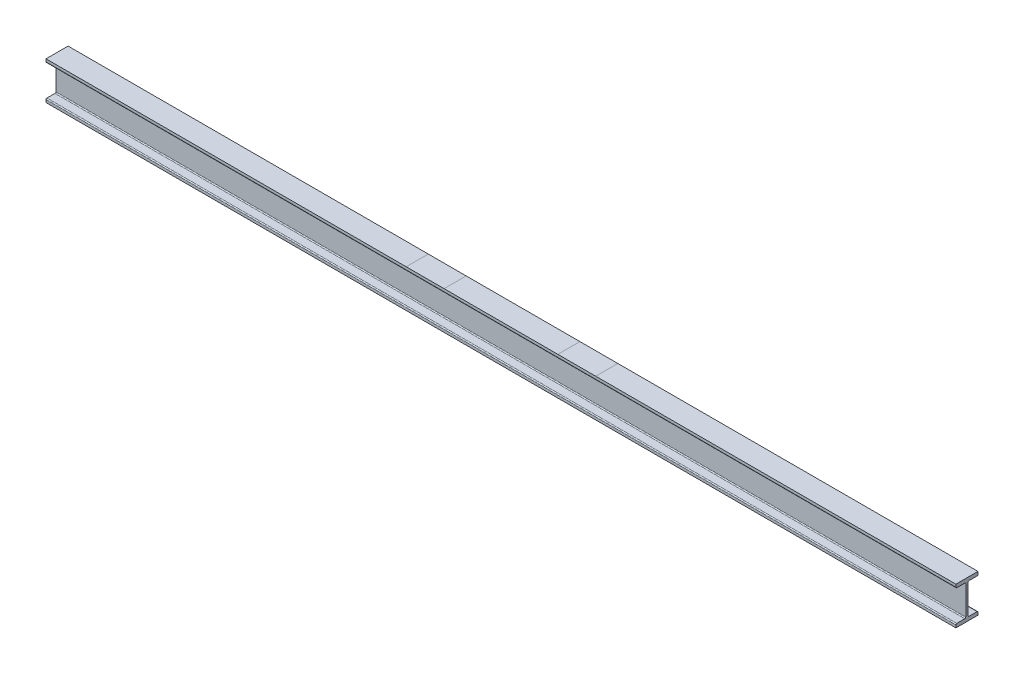
ISO-10303-21;
HEADER;
FILE_DESCRIPTION(('STEP AP214'),'2;1');
FILE_NAME('part.step','',(''),(''),'','','');
FILE_SCHEMA(('AUTOMOTIVE_DESIGN { 1 0 10303 214 1 1 1 1 }'));
ENDSEC;
DATA;
#1=APPLICATION_CONTEXT('core data for automotive mechanical design processes');
#2=APPLICATION_PROTOCOL_DEFINITION('international standard','automotive_design',2000,#1);
#3=PRODUCT_CONTEXT('',#1,'mechanical');
#4=PRODUCT('Part','Part','',(#3));
#5=PRODUCT_RELATED_PRODUCT_CATEGORY('part','',(#4));
#6=PRODUCT_DEFINITION_FORMATION('','',#4);
#7=PRODUCT_DEFINITION_CONTEXT('part definition',#1,'design');
#8=PRODUCT_DEFINITION('design','',#6,#7);
#9=PRODUCT_DEFINITION_SHAPE('','',#8);
#10=(LENGTH_UNIT() NAMED_UNIT(*) SI_UNIT(.MILLI.,.METRE.));
#11=(NAMED_UNIT(*) PLANE_ANGLE_UNIT() SI_UNIT($,.RADIAN.));
#12=(NAMED_UNIT(*) SI_UNIT($,.STERADIAN.) SOLID_ANGLE_UNIT());
#13=UNCERTAINTY_MEASURE_WITH_UNIT(LENGTH_MEASURE(1.E-05),#10,'distance_accuracy_value','');
#14=(GEOMETRIC_REPRESENTATION_CONTEXT(3) GLOBAL_UNCERTAINTY_ASSIGNED_CONTEXT((#13)) GLOBAL_UNIT_ASSIGNED_CONTEXT((#10,
#11,#12)) REPRESENTATION_CONTEXT('',''));
#15=CARTESIAN_POINT('',(0.,0.,0.));
#16=DIRECTION('',(0.,0.,1.));
#17=DIRECTION('',(1.,0.,0.));
#18=AXIS2_PLACEMENT_3D('',#15,#16,#17);
#19=CARTESIAN_POINT('',(2365.56791139241,50.8,29.591));
#20=DIRECTION('',(0.,-1.,0.));
#21=DIRECTION('',(0.,0.,-1.));
#22=AXIS2_PLACEMENT_3D('',#19,#20,#21);
#23=PLANE('',#22);
#24=DIRECTION('',(0.,0.,1.));
#25=VECTOR('',#24,1.);
#26=CARTESIAN_POINT('',(1400.36791139241,50.8,29.591));
#27=LINE('',#26,#25);
#28=CARTESIAN_POINT('',(1400.36791139241,50.8,-29.591));
#29=VERTEX_POINT('',#28);
#30=CARTESIAN_POINT('',(1400.36791139241,50.8,29.591));
#31=VERTEX_POINT('',#30);
#32=EDGE_CURVE('E11',#29,#31,#27,.T.);
#33=ORIENTED_EDGE('',*,*,#32,.F.);
#34=DIRECTION('',(-1.,0.,0.));
#35=VECTOR('',#34,1.);
#36=CARTESIAN_POINT('',(2365.56791139241,50.8,-29.591));
#37=LINE('',#36,#35);
#38=CARTESIAN_POINT('',(1298.76791139241,50.8,-29.591));
#39=VERTEX_POINT('',#38);
#40=EDGE_CURVE('E246',#29,#39,#37,.T.);
#41=ORIENTED_EDGE('',*,*,#40,.T.);
#42=DIRECTION('',(0.,0.,1.));
#43=VECTOR('',#42,1.);
#44=CARTESIAN_POINT('',(1298.76791139241,50.8,29.591));
#45=LINE('',#44,#43);
#46=CARTESIAN_POINT('',(1298.76791139241,50.8,29.591));
#47=VERTEX_POINT('',#46);
#48=EDGE_CURVE('E52',#39,#47,#45,.T.);
#49=ORIENTED_EDGE('',*,*,#48,.T.);
#50=DIRECTION('',(-1.,0.,0.));
#51=VECTOR('',#50,1.);
#52=CARTESIAN_POINT('',(2365.56791139241,50.8,29.591));
#53=LINE('',#52,#51);
#54=EDGE_CURVE('E244',#31,#47,#53,.T.);
#55=ORIENTED_EDGE('',*,*,#54,.F.);
#56=EDGE_LOOP('',(#33,#41,#49,#55));
#57=FACE_BOUND('',#56,.T.);
#58=ADVANCED_FACE('F43',(#57),#23,.F.);
#59=ORIENTED_EDGE('',*,*,#48,.F.);
#60=CARTESIAN_POINT('',(993.967911392406,50.8,-29.591));
#61=VERTEX_POINT('',#60);
#62=EDGE_CURVE('E423',#39,#61,#37,.T.);
#63=ORIENTED_EDGE('',*,*,#62,.T.);
#64=DIRECTION('',(0.,0.,1.));
#65=VECTOR('',#64,1.);
#66=CARTESIAN_POINT('',(993.967911392406,50.8,29.5910000000001));
#67=LINE('',#66,#65);
#68=CARTESIAN_POINT('',(993.967911392406,50.8,29.591));
#69=VERTEX_POINT('',#68);
#70=EDGE_CURVE('E230',#61,#69,#67,.T.);
#71=ORIENTED_EDGE('',*,*,#70,.T.);
#72=EDGE_CURVE('E249',#47,#69,#53,.T.);
#73=ORIENTED_EDGE('',*,*,#72,.F.);
#74=EDGE_LOOP('',(#59,#63,#71,#73));
#75=FACE_BOUND('',#74,.T.);
#76=ADVANCED_FACE('F250',(#75),#23,.F.);
#77=ORIENTED_EDGE('',*,*,#70,.F.);
#78=CARTESIAN_POINT('',(892.367911392405,50.8,-29.591));
#79=VERTEX_POINT('',#78);
#80=EDGE_CURVE('E424',#61,#79,#37,.T.);
#81=ORIENTED_EDGE('',*,*,#80,.T.);
#82=DIRECTION('',(0.,0.,1.));
#83=VECTOR('',#82,1.);
#84=CARTESIAN_POINT('',(892.367911392405,50.8,29.591));
#85=LINE('',#84,#83);
#86=CARTESIAN_POINT('',(892.367911392405,50.8,29.591));
#87=VERTEX_POINT('',#86);
#88=EDGE_CURVE('E226',#79,#87,#85,.T.);
#89=ORIENTED_EDGE('',*,*,#88,.T.);
#90=EDGE_CURVE('E254',#69,#87,#53,.T.);
#91=ORIENTED_EDGE('',*,*,#90,.F.);
#92=EDGE_LOOP('',(#77,#81,#89,#91));
#93=FACE_BOUND('',#92,.T.);
#94=ADVANCED_FACE('F426',(#93),#23,.F.);
#95=ORIENTED_EDGE('',*,*,#88,.F.);
#96=CARTESIAN_POINT('',(-72.832088607595,50.8,-29.591));
#97=VERTEX_POINT('',#96);
#98=EDGE_CURVE('E260',#79,#97,#37,.T.);
#99=ORIENTED_EDGE('',*,*,#98,.T.);
#100=DIRECTION('',(0.,0.,1.));
#101=VECTOR('',#100,1.);
#102=CARTESIAN_POINT('',(-72.832088607595,50.8,29.591));
#103=LINE('',#102,#101);
#104=CARTESIAN_POINT('',(-72.832088607595,50.8,29.591));
#105=VERTEX_POINT('',#104);
#106=EDGE_CURVE('E316',#97,#105,#103,.T.);
#107=ORIENTED_EDGE('',*,*,#106,.T.);
#108=EDGE_CURVE('E257',#87,#105,#53,.T.);
#109=ORIENTED_EDGE('',*,*,#108,.F.);
#110=EDGE_LOOP('',(#95,#99,#107,#109));
#111=FACE_BOUND('',#110,.T.);
#112=ADVANCED_FACE('F372',(#111),#23,.F.);
#113=CARTESIAN_POINT('',(2365.56791139241,-50.8,-29.591));
#114=DIRECTION('',(0.,1.,0.));
#115=DIRECTION('',(0.,0.,1.));
#116=AXIS2_PLACEMENT_3D('',#113,#114,#115);
#117=PLANE('',#116);
#118=DIRECTION('',(0.,0.,-1.));
#119=VECTOR('',#118,1.);
#120=CARTESIAN_POINT('',(-72.832088607595,-50.8,-29.591));
#121=LINE('',#120,#119);
#122=CARTESIAN_POINT('',(-72.832088607595,-50.8,29.591));
#123=VERTEX_POINT('',#122);
#124=CARTESIAN_POINT('',(-72.832088607595,-50.8,-29.591));
#125=VERTEX_POINT('',#124);
#126=EDGE_CURVE('E225',#123,#125,#121,.T.);
#127=ORIENTED_EDGE('',*,*,#126,.T.);
#128=DIRECTION('',(-1.,0.,0.));
#129=VECTOR('',#128,1.);
#130=CARTESIAN_POINT('',(2365.56791139241,-50.8,-29.591));
#131=LINE('',#130,#129);
#132=CARTESIAN_POINT('',(2365.56791139241,-50.8,-29.591));
#133=VERTEX_POINT('',#132);
#134=EDGE_CURVE('E206',#133,#125,#131,.T.);
#135=ORIENTED_EDGE('',*,*,#134,.F.);
#136=DIRECTION('',(0.,0.,-1.));
#137=VECTOR('',#136,1.);
#138=CARTESIAN_POINT('',(2365.56791139241,-50.8,-29.591));
#139=LINE('',#138,#137);
#140=CARTESIAN_POINT('',(2365.56791139241,-50.8,29.591));
#141=VERTEX_POINT('',#140);
#142=EDGE_CURVE('E213',#141,#133,#139,.T.);
#143=ORIENTED_EDGE('',*,*,#142,.F.);
#144=DIRECTION('',(-1.,0.,0.));
#145=VECTOR('',#144,1.);
#146=CARTESIAN_POINT('',(2365.56791139241,-50.8,29.591));
#147=LINE('',#146,#145);
#148=EDGE_CURVE('E336',#141,#123,#147,.T.);
#149=ORIENTED_EDGE('',*,*,#148,.T.);
#150=EDGE_LOOP('',(#127,#135,#143,#149));
#151=FACE_BOUND('',#150,.T.);
#152=ADVANCED_FACE('F45',(#151),#117,.F.);
#153=CARTESIAN_POINT('',(2365.56791139241,-43.9165999999998,-29.591));
#154=DIRECTION('',(0.,0.,1.));
#155=DIRECTION('',(0.,-1.,0.));
#156=AXIS2_PLACEMENT_3D('',#153,#154,#155);
#157=PLANE('',#156);
#158=DIRECTION('',(0.,1.,0.));
#159=VECTOR('',#158,1.);
#160=CARTESIAN_POINT('',(-72.832088607595,-43.9165999999998,-29.591));
#161=LINE('',#160,#159);
#162=CARTESIAN_POINT('',(-72.832088607595,-43.9165999999998,-29.591));
#163=VERTEX_POINT('',#162);
#164=EDGE_CURVE('E302',#125,#163,#161,.T.);
#165=ORIENTED_EDGE('',*,*,#164,.T.);
#166=DIRECTION('',(-1.,0.,0.));
#167=VECTOR('',#166,1.);
#168=CARTESIAN_POINT('',(2365.56791139241,-43.9165999999998,-29.591));
#169=LINE('',#168,#167);
#170=CARTESIAN_POINT('',(2365.56791139241,-43.9165999999998,-29.591));
#171=VERTEX_POINT('',#170);
#172=EDGE_CURVE('E209',#171,#163,#169,.T.);
#173=ORIENTED_EDGE('',*,*,#172,.F.);
#174=DIRECTION('',(0.,1.,0.));
#175=VECTOR('',#174,1.);
#176=CARTESIAN_POINT('',(2365.56791139241,-43.9165999999998,-29.591));
#177=LINE('',#176,#175);
#178=EDGE_CURVE('E202',#133,#171,#177,.T.);
#179=ORIENTED_EDGE('',*,*,#178,.F.);
#180=ORIENTED_EDGE('',*,*,#134,.T.);
#181=EDGE_LOOP('',(#165,#173,#179,#180));
#182=FACE_BOUND('',#181,.T.);
#183=ADVANCED_FACE('F204',(#182),#157,.F.);
#184=CARTESIAN_POINT('',(2365.56791139241,-43.9165999999998,-27.051));
#185=DIRECTION('',(-1.,0.,0.));
#186=DIRECTION('',(0.,0.,1.));
#187=AXIS2_PLACEMENT_3D('',#184,#185,#186);
#188=CYLINDRICAL_SURFACE('',#187,2.54);
#189=CARTESIAN_POINT('',(-72.832088607595,-43.9165999999998,-27.051));
#190=DIRECTION('',(1.,0.,0.));
#191=DIRECTION('',(0.,0.,-1.));
#192=AXIS2_PLACEMENT_3D('',#189,#190,#191);
#193=CIRCLE('',#192,2.54);
#194=CARTESIAN_POINT('',(-72.832088607595,-41.3765999999998,-27.0509999999999));
#195=VERTEX_POINT('',#194);
#196=EDGE_CURVE('E296',#163,#195,#193,.T.);
#197=ORIENTED_EDGE('',*,*,#196,.T.);
#198=DIRECTION('',(-1.,0.,0.));
#199=VECTOR('',#198,1.);
#200=CARTESIAN_POINT('',(2365.56791139241,-41.3765999999998,-27.0509999999999));
#201=LINE('',#200,#199);
#202=CARTESIAN_POINT('',(2365.56791139241,-41.3765999999998,-27.0509999999999));
#203=VERTEX_POINT('',#202);
#204=EDGE_CURVE('E232',#203,#195,#201,.T.);
#205=ORIENTED_EDGE('',*,*,#204,.F.);
#206=CARTESIAN_POINT('',(2365.56791139241,-43.9165999999998,-27.051));
#207=DIRECTION('',(1.,0.,0.));
#208=DIRECTION('',(0.,0.,-1.));
#209=AXIS2_PLACEMENT_3D('',#206,#207,#208);
#210=CIRCLE('',#209,2.54);
#211=EDGE_CURVE('E212',#171,#203,#210,.T.);
#212=ORIENTED_EDGE('',*,*,#211,.F.);
#213=ORIENTED_EDGE('',*,*,#172,.T.);
#214=EDGE_LOOP('',(#197,#205,#212,#213));
#215=FACE_BOUND('',#214,.T.);
#216=ADVANCED_FACE('F398',(#215),#188,.T.);
#217=CARTESIAN_POINT('',(2365.56791139241,-41.3765999999999,-5.76579999999979));
#218=DIRECTION('',(0.,-1.,0.));
#219=DIRECTION('',(0.,0.,-1.));
#220=AXIS2_PLACEMENT_3D('',#217,#218,#219);
#221=PLANE('',#220);
#222=DIRECTION('',(0.,0.,1.));
#223=VECTOR('',#222,1.);
#224=CARTESIAN_POINT('',(-72.832088607595,-41.3765999999999,-5.76579999999979));
#225=LINE('',#224,#223);
#226=CARTESIAN_POINT('',(-72.832088607595,-41.3765999999999,-5.76579999999979));
#227=VERTEX_POINT('',#226);
#228=EDGE_CURVE('E289',#195,#227,#225,.T.);
#229=ORIENTED_EDGE('',*,*,#228,.T.);
#230=DIRECTION('',(-1.,0.,0.));
#231=VECTOR('',#230,1.);
#232=CARTESIAN_POINT('',(2365.56791139241,-41.3765999999999,-5.76579999999979));
#233=LINE('',#232,#231);
#234=CARTESIAN_POINT('',(2365.56791139241,-41.3765999999999,-5.76579999999979));
#235=VERTEX_POINT('',#234);
#236=EDGE_CURVE('E280',#235,#227,#233,.T.);
#237=ORIENTED_EDGE('',*,*,#236,.F.);
#238=DIRECTION('',(0.,0.,1.));
#239=VECTOR('',#238,1.);
#240=CARTESIAN_POINT('',(2365.56791139241,-41.3765999999999,-5.76579999999979));
#241=LINE('',#240,#239);
#242=EDGE_CURVE('E290',#203,#235,#241,.T.);
#243=ORIENTED_EDGE('',*,*,#242,.F.);
#244=ORIENTED_EDGE('',*,*,#204,.T.);
#245=EDGE_LOOP('',(#229,#237,#243,#244));
#246=FACE_BOUND('',#245,.T.);
#247=ADVANCED_FACE('F287',(#246),#221,.F.);
#248=CARTESIAN_POINT('',(2365.56791139241,-38.8365999999999,-5.76579999999979));
#249=DIRECTION('',(-1.,0.,0.));
#250=DIRECTION('',(0.,0.,1.));
#251=AXIS2_PLACEMENT_3D('',#248,#249,#250);
#252=CYLINDRICAL_SURFACE('',#251,2.54);
#253=CARTESIAN_POINT('',(-72.832088607595,-38.8365999999999,-5.76579999999979));
#254=DIRECTION('',(-1.,0.,0.));
#255=DIRECTION('',(0.,0.,-1.));
#256=AXIS2_PLACEMENT_3D('',#253,#254,#255);
#257=CIRCLE('',#256,2.54);
#258=CARTESIAN_POINT('',(-72.832088607595,-38.8365999999999,-3.22579999999979));
#259=VERTEX_POINT('',#258);
#260=EDGE_CURVE('E298',#227,#259,#257,.T.);
#261=ORIENTED_EDGE('',*,*,#260,.T.);
#262=DIRECTION('',(-1.,0.,0.));
#263=VECTOR('',#262,1.);
#264=CARTESIAN_POINT('',(2365.56791139241,-38.8365999999999,-3.22579999999979));
#265=LINE('',#264,#263);
#266=CARTESIAN_POINT('',(2365.56791139241,-38.8365999999999,-3.22579999999979));
#267=VERTEX_POINT('',#266);
#268=EDGE_CURVE('E277',#267,#259,#265,.T.);
#269=ORIENTED_EDGE('',*,*,#268,.F.);
#270=CARTESIAN_POINT('',(2365.56791139241,-38.8365999999999,-5.76579999999979));
#271=DIRECTION('',(-1.,0.,0.));
#272=DIRECTION('',(0.,0.,-1.));
#273=AXIS2_PLACEMENT_3D('',#270,#271,#272);
#274=CIRCLE('',#273,2.54);
#275=EDGE_CURVE('E400',#235,#267,#274,.T.);
#276=ORIENTED_EDGE('',*,*,#275,.F.);
#277=ORIENTED_EDGE('',*,*,#236,.T.);
#278=EDGE_LOOP('',(#261,#269,#276,#277));
#279=FACE_BOUND('',#278,.T.);
#280=ADVANCED_FACE('F449',(#279),#252,.F.);
#281=CARTESIAN_POINT('',(2365.56791139241,38.8366,-3.22580000000023));
#282=DIRECTION('',(0.,0.,1.));
#283=DIRECTION('',(0.,-1.,0.));
#284=AXIS2_PLACEMENT_3D('',#281,#282,#283);
#285=PLANE('',#284);
#286=DIRECTION('',(0.,1.,0.));
#287=VECTOR('',#286,1.);
#288=CARTESIAN_POINT('',(-72.832088607595,38.8366,-3.22580000000023));
#289=LINE('',#288,#287);
#290=CARTESIAN_POINT('',(-72.832088607595,38.8366,-3.22580000000023));
#291=VERTEX_POINT('',#290);
#292=EDGE_CURVE('E300',#259,#291,#289,.T.);
#293=ORIENTED_EDGE('',*,*,#292,.T.);
#294=DIRECTION('',(-1.,0.,0.));
#295=VECTOR('',#294,1.);
#296=CARTESIAN_POINT('',(2365.56791139241,38.8366,-3.22580000000023));
#297=LINE('',#296,#295);
#298=CARTESIAN_POINT('',(2365.56791139241,38.8366,-3.22580000000023));
#299=VERTEX_POINT('',#298);
#300=EDGE_CURVE('E274',#299,#291,#297,.T.);
#301=ORIENTED_EDGE('',*,*,#300,.F.);
#302=DIRECTION('',(0.,1.,0.));
#303=VECTOR('',#302,1.);
#304=CARTESIAN_POINT('',(2365.56791139241,38.8366,-3.22580000000023));
#305=LINE('',#304,#303);
#306=EDGE_CURVE('E404',#267,#299,#305,.T.);
#307=ORIENTED_EDGE('',*,*,#306,.F.);
#308=ORIENTED_EDGE('',*,*,#268,.T.);
#309=EDGE_LOOP('',(#293,#301,#307,#308));
#310=FACE_BOUND('',#309,.T.);
#311=ADVANCED_FACE('F444',(#310),#285,.F.);
#312=CARTESIAN_POINT('',(2365.56791139241,38.8366000000001,-5.76580000000022));
#313=DIRECTION('',(-1.,0.,0.));
#314=DIRECTION('',(0.,0.,1.));
#315=AXIS2_PLACEMENT_3D('',#312,#313,#314);
#316=CYLINDRICAL_SURFACE('',#315,2.53999999999999);
#317=CARTESIAN_POINT('',(-72.832088607595,38.8366000000001,-5.76580000000022));
#318=DIRECTION('',(-1.,0.,0.));
#319=DIRECTION('',(0.,0.,-1.));
#320=AXIS2_PLACEMENT_3D('',#317,#318,#319);
#321=CIRCLE('',#320,2.53999999999999);
#322=CARTESIAN_POINT('',(-72.832088607595,41.3766,-5.76580000000028));
#323=VERTEX_POINT('',#322);
#324=EDGE_CURVE('E307',#291,#323,#321,.T.);
#325=ORIENTED_EDGE('',*,*,#324,.T.);
#326=DIRECTION('',(-1.,0.,0.));
#327=VECTOR('',#326,1.);
#328=CARTESIAN_POINT('',(2365.56791139241,41.3766,-5.76580000000028));
#329=LINE('',#328,#327);
#330=CARTESIAN_POINT('',(2365.56791139241,41.3766,-5.76580000000028));
#331=VERTEX_POINT('',#330);
#332=EDGE_CURVE('E271',#331,#323,#329,.T.);
#333=ORIENTED_EDGE('',*,*,#332,.F.);
#334=CARTESIAN_POINT('',(2365.56791139241,38.8366000000001,-5.76580000000022));
#335=DIRECTION('',(-1.,0.,0.));
#336=DIRECTION('',(0.,0.,-1.));
#337=AXIS2_PLACEMENT_3D('',#334,#335,#336);
#338=CIRCLE('',#337,2.53999999999999);
#339=EDGE_CURVE('E406',#299,#331,#338,.T.);
#340=ORIENTED_EDGE('',*,*,#339,.F.);
#341=ORIENTED_EDGE('',*,*,#300,.T.);
#342=EDGE_LOOP('',(#325,#333,#340,#341));
#343=FACE_BOUND('',#342,.T.);
#344=ADVANCED_FACE('F441',(#343),#316,.F.);
#345=CARTESIAN_POINT('',(2365.56791139241,41.3765999999998,-27.051));
#346=DIRECTION('',(0.,1.,0.));
#347=DIRECTION('',(0.,0.,1.));
#348=AXIS2_PLACEMENT_3D('',#345,#346,#347);
#349=PLANE('',#348);
#350=DIRECTION('',(0.,0.,-1.));
#351=VECTOR('',#350,1.);
#352=CARTESIAN_POINT('',(-72.832088607595,41.3765999999998,-27.051));
#353=LINE('',#352,#351);
#354=CARTESIAN_POINT('',(-72.832088607595,41.3765999999998,-27.051));
#355=VERTEX_POINT('',#354);
#356=EDGE_CURVE('E309',#323,#355,#353,.T.);
#357=ORIENTED_EDGE('',*,*,#356,.T.);
#358=DIRECTION('',(-1.,0.,0.));
#359=VECTOR('',#358,1.);
#360=CARTESIAN_POINT('',(2365.56791139241,41.3765999999998,-27.051));
#361=LINE('',#360,#359);
#362=CARTESIAN_POINT('',(2365.56791139241,41.3765999999998,-27.051));
#363=VERTEX_POINT('',#362);
#364=EDGE_CURVE('E268',#363,#355,#361,.T.);
#365=ORIENTED_EDGE('',*,*,#364,.F.);
#366=DIRECTION('',(0.,0.,-1.));
#367=VECTOR('',#366,1.);
#368=CARTESIAN_POINT('',(2365.56791139241,41.3765999999998,-27.051));
#369=LINE('',#368,#367);
#370=EDGE_CURVE('E408',#331,#363,#369,.T.);
#371=ORIENTED_EDGE('',*,*,#370,.F.);
#372=ORIENTED_EDGE('',*,*,#332,.T.);
#373=EDGE_LOOP('',(#357,#365,#371,#372));
#374=FACE_BOUND('',#373,.T.);
#375=ADVANCED_FACE('F437',(#374),#349,.F.);
#376=CARTESIAN_POINT('',(2365.56791139241,43.9165999999998,-27.051));
#377=DIRECTION('',(-1.,0.,0.));
#378=DIRECTION('',(0.,0.,1.));
#379=AXIS2_PLACEMENT_3D('',#376,#377,#378);
#380=CYLINDRICAL_SURFACE('',#379,2.54);
#381=CARTESIAN_POINT('',(-72.832088607595,43.9165999999998,-27.051));
#382=DIRECTION('',(1.,0.,0.));
#383=DIRECTION('',(0.,0.,-1.));
#384=AXIS2_PLACEMENT_3D('',#381,#382,#383);
#385=CIRCLE('',#384,2.54);
#386=CARTESIAN_POINT('',(-72.832088607595,43.9165999999998,-29.591));
#387=VERTEX_POINT('',#386);
#388=EDGE_CURVE('E311',#355,#387,#385,.T.);
#389=ORIENTED_EDGE('',*,*,#388,.T.);
#390=DIRECTION('',(-1.,0.,0.));
#391=VECTOR('',#390,1.);
#392=CARTESIAN_POINT('',(2365.56791139241,43.9165999999998,-29.591));
#393=LINE('',#392,#391);
#394=CARTESIAN_POINT('',(2365.56791139241,43.9165999999998,-29.591));
#395=VERTEX_POINT('',#394);
#396=EDGE_CURVE('E265',#395,#387,#393,.T.);
#397=ORIENTED_EDGE('',*,*,#396,.F.);
#398=CARTESIAN_POINT('',(2365.56791139241,43.9165999999998,-27.051));
#399=DIRECTION('',(1.,0.,0.));
#400=DIRECTION('',(0.,0.,-1.));
#401=AXIS2_PLACEMENT_3D('',#398,#399,#400);
#402=CIRCLE('',#401,2.54);
#403=EDGE_CURVE('E410',#363,#395,#402,.T.);
#404=ORIENTED_EDGE('',*,*,#403,.F.);
#405=ORIENTED_EDGE('',*,*,#364,.T.);
#406=EDGE_LOOP('',(#389,#397,#404,#405));
#407=FACE_BOUND('',#406,.T.);
#408=ADVANCED_FACE('F432',(#407),#380,.T.);
#409=CARTESIAN_POINT('',(2365.56791139241,50.8,-29.591));
#410=DIRECTION('',(0.,0.,1.));
#411=DIRECTION('',(0.,-1.,0.));
#412=AXIS2_PLACEMENT_3D('',#409,#410,#411);
#413=PLANE('',#412);
#414=DIRECTION('',(0.,1.,0.));
#415=VECTOR('',#414,1.);
#416=CARTESIAN_POINT('',(-72.832088607595,50.8,-29.591));
#417=LINE('',#416,#415);
#418=EDGE_CURVE('E313',#387,#97,#417,.T.);
#419=ORIENTED_EDGE('',*,*,#418,.T.);
#420=ORIENTED_EDGE('',*,*,#98,.F.);
#421=ORIENTED_EDGE('',*,*,#80,.F.);
#422=ORIENTED_EDGE('',*,*,#62,.F.);
#423=ORIENTED_EDGE('',*,*,#40,.F.);
#424=CARTESIAN_POINT('',(2365.56791139241,50.8,-29.591));
#425=VERTEX_POINT('',#424);
#426=EDGE_CURVE('E263',#425,#29,#37,.T.);
#427=ORIENTED_EDGE('',*,*,#426,.F.);
#428=DIRECTION('',(0.,1.,0.));
#429=VECTOR('',#428,1.);
#430=CARTESIAN_POINT('',(2365.56791139241,50.8,-29.591));
#431=LINE('',#430,#429);
#432=EDGE_CURVE('E412',#395,#425,#431,.T.);
#433=ORIENTED_EDGE('',*,*,#432,.F.);
#434=ORIENTED_EDGE('',*,*,#396,.T.);
#435=EDGE_LOOP('',(#419,#420,#421,#422,#423,#427,#433,#434));
#436=FACE_BOUND('',#435,.T.);
#437=ADVANCED_FACE('F421',(#436),#413,.F.);
#438=ORIENTED_EDGE('',*,*,#426,.T.);
#439=ORIENTED_EDGE('',*,*,#32,.T.);
#440=CARTESIAN_POINT('',(2365.56791139241,50.8,29.591));
#441=VERTEX_POINT('',#440);
#442=EDGE_CURVE('E256',#441,#31,#53,.T.);
#443=ORIENTED_EDGE('',*,*,#442,.F.);
#444=DIRECTION('',(0.,0.,1.));
#445=VECTOR('',#444,1.);
#446=CARTESIAN_POINT('',(2365.56791139241,50.8,29.591));
#447=LINE('',#446,#445);
#448=EDGE_CURVE('E414',#425,#441,#447,.T.);
#449=ORIENTED_EDGE('',*,*,#448,.F.);
#450=EDGE_LOOP('',(#438,#439,#443,#449));
#451=FACE_BOUND('',#450,.T.);
#452=ADVANCED_FACE('F417',(#451),#23,.F.);
#453=CARTESIAN_POINT('',(2365.56791139241,43.9165999999998,29.591));
#454=DIRECTION('',(0.,0.,-1.));
#455=DIRECTION('',(0.,1.,0.));
#456=AXIS2_PLACEMENT_3D('',#453,#454,#455);
#457=PLANE('',#456);
#458=DIRECTION('',(0.,-1.,0.));
#459=VECTOR('',#458,1.);
#460=CARTESIAN_POINT('',(-72.832088607595,43.9165999999998,29.591));
#461=LINE('',#460,#459);
#462=CARTESIAN_POINT('',(-72.832088607595,43.9165999999998,29.591));
#463=VERTEX_POINT('',#462);
#464=EDGE_CURVE('E319',#105,#463,#461,.T.);
#465=ORIENTED_EDGE('',*,*,#464,.T.);
#466=DIRECTION('',(-1.,0.,0.));
#467=VECTOR('',#466,1.);
#468=CARTESIAN_POINT('',(2365.56791139241,43.9165999999998,29.591));
#469=LINE('',#468,#467);
#470=CARTESIAN_POINT('',(2365.56791139241,43.9165999999998,29.591));
#471=VERTEX_POINT('',#470);
#472=EDGE_CURVE('E261',#471,#463,#469,.T.);
#473=ORIENTED_EDGE('',*,*,#472,.F.);
#474=DIRECTION('',(0.,-1.,0.));
#475=VECTOR('',#474,1.);
#476=CARTESIAN_POINT('',(2365.56791139241,43.9165999999998,29.591));
#477=LINE('',#476,#475);
#478=EDGE_CURVE('E386',#441,#471,#477,.T.);
#479=ORIENTED_EDGE('',*,*,#478,.F.);
#480=ORIENTED_EDGE('',*,*,#442,.T.);
#481=ORIENTED_EDGE('',*,*,#54,.T.);
#482=ORIENTED_EDGE('',*,*,#72,.T.);
#483=ORIENTED_EDGE('',*,*,#90,.T.);
#484=ORIENTED_EDGE('',*,*,#108,.T.);
#485=EDGE_LOOP('',(#465,#473,#479,#480,#481,#482,#483,#484));
#486=FACE_BOUND('',#485,.T.);
#487=ADVANCED_FACE('F367',(#486),#457,.F.);
#488=CARTESIAN_POINT('',(2365.56791139241,43.9165999999998,27.051));
#489=DIRECTION('',(-1.,0.,0.));
#490=DIRECTION('',(0.,0.,1.));
#491=AXIS2_PLACEMENT_3D('',#488,#489,#490);
#492=CYLINDRICAL_SURFACE('',#491,2.54);
#493=CARTESIAN_POINT('',(-72.832088607595,43.9165999999998,27.051));
#494=DIRECTION('',(1.,0.,0.));
#495=DIRECTION('',(0.,0.,1.));
#496=AXIS2_PLACEMENT_3D('',#493,#494,#495);
#497=CIRCLE('',#496,2.54);
#498=CARTESIAN_POINT('',(-72.832088607595,41.3765999999998,27.0509999999999));
#499=VERTEX_POINT('',#498);
#500=EDGE_CURVE('E321',#463,#499,#497,.T.);
#501=ORIENTED_EDGE('',*,*,#500,.T.);
#502=DIRECTION('',(-1.,0.,0.));
#503=VECTOR('',#502,1.);
#504=CARTESIAN_POINT('',(2365.56791139241,41.3765999999998,27.0509999999999));
#505=LINE('',#504,#503);
#506=CARTESIAN_POINT('',(2365.56791139241,41.3765999999998,27.0509999999999));
#507=VERTEX_POINT('',#506);
#508=EDGE_CURVE('E355',#507,#499,#505,.T.);
#509=ORIENTED_EDGE('',*,*,#508,.F.);
#510=CARTESIAN_POINT('',(2365.56791139241,43.9165999999998,27.051));
#511=DIRECTION('',(1.,0.,0.));
#512=DIRECTION('',(0.,0.,1.));
#513=AXIS2_PLACEMENT_3D('',#510,#511,#512);
#514=CIRCLE('',#513,2.54);
#515=EDGE_CURVE('E377',#471,#507,#514,.T.);
#516=ORIENTED_EDGE('',*,*,#515,.F.);
#517=ORIENTED_EDGE('',*,*,#472,.T.);
#518=EDGE_LOOP('',(#501,#509,#516,#517));
#519=FACE_BOUND('',#518,.T.);
#520=ADVANCED_FACE('F376',(#519),#492,.T.);
#521=CARTESIAN_POINT('',(2365.56791139241,41.3766000000001,5.76579999999982));
#522=DIRECTION('',(0.,1.,0.));
#523=DIRECTION('',(0.,0.,1.));
#524=AXIS2_PLACEMENT_3D('',#521,#522,#523);
#525=PLANE('',#524);
#526=DIRECTION('',(0.,0.,-1.));
#527=VECTOR('',#526,1.);
#528=CARTESIAN_POINT('',(-72.832088607595,41.3766000000001,5.76579999999982));
#529=LINE('',#528,#527);
#530=CARTESIAN_POINT('',(-72.832088607595,41.3766000000001,5.76579999999982));
#531=VERTEX_POINT('',#530);
#532=EDGE_CURVE('E323',#499,#531,#529,.T.);
#533=ORIENTED_EDGE('',*,*,#532,.T.);
#534=DIRECTION('',(-1.,0.,0.));
#535=VECTOR('',#534,1.);
#536=CARTESIAN_POINT('',(2365.56791139241,41.3766000000001,5.76579999999982));
#537=LINE('',#536,#535);
#538=CARTESIAN_POINT('',(2365.56791139241,41.3766000000001,5.76579999999982));
#539=VERTEX_POINT('',#538);
#540=EDGE_CURVE('E353',#539,#531,#537,.T.);
#541=ORIENTED_EDGE('',*,*,#540,.F.);
#542=DIRECTION('',(0.,0.,-1.));
#543=VECTOR('',#542,1.);
#544=CARTESIAN_POINT('',(2365.56791139241,41.3766000000001,5.76579999999982));
#545=LINE('',#544,#543);
#546=EDGE_CURVE('E379',#507,#539,#545,.T.);
#547=ORIENTED_EDGE('',*,*,#546,.F.);
#548=ORIENTED_EDGE('',*,*,#508,.T.);
#549=EDGE_LOOP('',(#533,#541,#547,#548));
#550=FACE_BOUND('',#549,.T.);
#551=ADVANCED_FACE('F380',(#550),#525,.F.);
#552=CARTESIAN_POINT('',(2365.56791139241,38.8366000000001,5.76579999999979));
#553=DIRECTION('',(-1.,0.,0.));
#554=DIRECTION('',(0.,0.,1.));
#555=AXIS2_PLACEMENT_3D('',#552,#553,#554);
#556=CYLINDRICAL_SURFACE('',#555,2.54000000000001);
#557=CARTESIAN_POINT('',(-72.832088607595,38.8366000000001,5.76579999999979));
#558=DIRECTION('',(-1.,0.,0.));
#559=DIRECTION('',(0.,0.,-1.));
#560=AXIS2_PLACEMENT_3D('',#557,#558,#559);
#561=CIRCLE('',#560,2.54000000000001);
#562=CARTESIAN_POINT('',(-72.832088607595,38.8366000000001,3.22579999999977));
#563=VERTEX_POINT('',#562);
#564=EDGE_CURVE('E325',#531,#563,#561,.T.);
#565=ORIENTED_EDGE('',*,*,#564,.T.);
#566=DIRECTION('',(-1.,0.,0.));
#567=VECTOR('',#566,1.);
#568=CARTESIAN_POINT('',(2365.56791139241,38.8366000000001,3.22579999999977));
#569=LINE('',#568,#567);
#570=CARTESIAN_POINT('',(2365.56791139241,38.8366000000001,3.22579999999977));
#571=VERTEX_POINT('',#570);
#572=EDGE_CURVE('E350',#571,#563,#569,.T.);
#573=ORIENTED_EDGE('',*,*,#572,.F.);
#574=CARTESIAN_POINT('',(2365.56791139241,38.8366000000001,5.76579999999979));
#575=DIRECTION('',(-1.,0.,0.));
#576=DIRECTION('',(0.,0.,-1.));
#577=AXIS2_PLACEMENT_3D('',#574,#575,#576);
#578=CIRCLE('',#577,2.54000000000001);
#579=EDGE_CURVE('E382',#539,#571,#578,.T.);
#580=ORIENTED_EDGE('',*,*,#579,.F.);
#581=ORIENTED_EDGE('',*,*,#540,.T.);
#582=EDGE_LOOP('',(#565,#573,#580,#581));
#583=FACE_BOUND('',#582,.T.);
#584=ADVANCED_FACE('F523',(#583),#556,.F.);
#585=CARTESIAN_POINT('',(2365.56791139241,-38.8365999999999,3.22580000000021));
#586=DIRECTION('',(0.,0.,-1.));
#587=DIRECTION('',(0.,1.,0.));
#588=AXIS2_PLACEMENT_3D('',#585,#586,#587);
#589=PLANE('',#588);
#590=DIRECTION('',(0.,-1.,0.));
#591=VECTOR('',#590,1.);
#592=CARTESIAN_POINT('',(-72.832088607595,-38.8365999999999,3.22580000000021));
#593=LINE('',#592,#591);
#594=CARTESIAN_POINT('',(-72.832088607595,-38.8365999999999,3.22580000000021));
#595=VERTEX_POINT('',#594);
#596=EDGE_CURVE('E327',#563,#595,#593,.T.);
#597=ORIENTED_EDGE('',*,*,#596,.T.);
#598=DIRECTION('',(-1.,0.,0.));
#599=VECTOR('',#598,1.);
#600=CARTESIAN_POINT('',(2365.56791139241,-38.8365999999999,3.22580000000021));
#601=LINE('',#600,#599);
#602=CARTESIAN_POINT('',(2365.56791139241,-38.8365999999999,3.22580000000021));
#603=VERTEX_POINT('',#602);
#604=EDGE_CURVE('E347',#603,#595,#601,.T.);
#605=ORIENTED_EDGE('',*,*,#604,.F.);
#606=DIRECTION('',(0.,-1.,0.));
#607=VECTOR('',#606,1.);
#608=CARTESIAN_POINT('',(2365.56791139241,-38.8365999999999,3.22580000000021));
#609=LINE('',#608,#607);
#610=EDGE_CURVE('E384',#571,#603,#609,.T.);
#611=ORIENTED_EDGE('',*,*,#610,.F.);
#612=ORIENTED_EDGE('',*,*,#572,.T.);
#613=EDGE_LOOP('',(#597,#605,#611,#612));
#614=FACE_BOUND('',#613,.T.);
#615=ADVANCED_FACE('F530',(#614),#589,.F.);
#616=CARTESIAN_POINT('',(2365.56791139241,-38.8365999999999,5.76580000000021));
#617=DIRECTION('',(-1.,0.,0.));
#618=DIRECTION('',(0.,0.,1.));
#619=AXIS2_PLACEMENT_3D('',#616,#617,#618);
#620=CYLINDRICAL_SURFACE('',#619,2.54);
#621=CARTESIAN_POINT('',(-72.832088607595,-38.8365999999999,5.76580000000021));
#622=DIRECTION('',(-1.,0.,0.));
#623=DIRECTION('',(0.,0.,-1.));
#624=AXIS2_PLACEMENT_3D('',#621,#622,#623);
#625=CIRCLE('',#624,2.54);
#626=CARTESIAN_POINT('',(-72.832088607595,-41.3765999999999,5.76580000000025));
#627=VERTEX_POINT('',#626);
#628=EDGE_CURVE('E329',#595,#627,#625,.T.);
#629=ORIENTED_EDGE('',*,*,#628,.T.);
#630=DIRECTION('',(-1.,0.,0.));
#631=VECTOR('',#630,1.);
#632=CARTESIAN_POINT('',(2365.56791139241,-41.3765999999999,5.76580000000025));
#633=LINE('',#632,#631);
#634=CARTESIAN_POINT('',(2365.56791139241,-41.3765999999999,5.76580000000025));
#635=VERTEX_POINT('',#634);
#636=EDGE_CURVE('E344',#635,#627,#633,.T.);
#637=ORIENTED_EDGE('',*,*,#636,.F.);
#638=CARTESIAN_POINT('',(2365.56791139241,-38.8365999999999,5.76580000000021));
#639=DIRECTION('',(-1.,0.,0.));
#640=DIRECTION('',(0.,0.,-1.));
#641=AXIS2_PLACEMENT_3D('',#638,#639,#640);
#642=CIRCLE('',#641,2.54);
#643=EDGE_CURVE('E391',#603,#635,#642,.T.);
#644=ORIENTED_EDGE('',*,*,#643,.F.);
#645=ORIENTED_EDGE('',*,*,#604,.T.);
#646=EDGE_LOOP('',(#629,#637,#644,#645));
#647=FACE_BOUND('',#646,.T.);
#648=ADVANCED_FACE('F538',(#647),#620,.F.);
#649=CARTESIAN_POINT('',(2365.56791139241,-41.3765999999998,27.051));
#650=DIRECTION('',(0.,-1.,0.));
#651=DIRECTION('',(0.,0.,-1.));
#652=AXIS2_PLACEMENT_3D('',#649,#650,#651);
#653=PLANE('',#652);
#654=DIRECTION('',(0.,0.,1.));
#655=VECTOR('',#654,1.);
#656=CARTESIAN_POINT('',(-72.832088607595,-41.3765999999998,27.051));
#657=LINE('',#656,#655);
#658=CARTESIAN_POINT('',(-72.832088607595,-41.3765999999998,27.051));
#659=VERTEX_POINT('',#658);
#660=EDGE_CURVE('E331',#627,#659,#657,.T.);
#661=ORIENTED_EDGE('',*,*,#660,.T.);
#662=DIRECTION('',(-1.,0.,0.));
#663=VECTOR('',#662,1.);
#664=CARTESIAN_POINT('',(2365.56791139241,-41.3765999999998,27.051));
#665=LINE('',#664,#663);
#666=CARTESIAN_POINT('',(2365.56791139241,-41.3765999999998,27.051));
#667=VERTEX_POINT('',#666);
#668=EDGE_CURVE('E341',#667,#659,#665,.T.);
#669=ORIENTED_EDGE('',*,*,#668,.F.);
#670=DIRECTION('',(0.,0.,1.));
#671=VECTOR('',#670,1.);
#672=CARTESIAN_POINT('',(2365.56791139241,-41.3765999999998,27.051));
#673=LINE('',#672,#671);
#674=EDGE_CURVE('E393',#635,#667,#673,.T.);
#675=ORIENTED_EDGE('',*,*,#674,.F.);
#676=ORIENTED_EDGE('',*,*,#636,.T.);
#677=EDGE_LOOP('',(#661,#669,#675,#676));
#678=FACE_BOUND('',#677,.T.);
#679=ADVANCED_FACE('F546',(#678),#653,.F.);
#680=CARTESIAN_POINT('',(2365.56791139241,-43.9165999999998,27.051));
#681=DIRECTION('',(-1.,0.,0.));
#682=DIRECTION('',(0.,0.,1.));
#683=AXIS2_PLACEMENT_3D('',#680,#681,#682);
#684=CYLINDRICAL_SURFACE('',#683,2.54);
#685=CARTESIAN_POINT('',(-72.832088607595,-43.9165999999998,27.051));
#686=DIRECTION('',(1.,0.,0.));
#687=DIRECTION('',(0.,0.,1.));
#688=AXIS2_PLACEMENT_3D('',#685,#686,#687);
#689=CIRCLE('',#688,2.54);
#690=CARTESIAN_POINT('',(-72.832088607595,-43.9165999999998,29.591));
#691=VERTEX_POINT('',#690);
#692=EDGE_CURVE('E333',#659,#691,#689,.T.);
#693=ORIENTED_EDGE('',*,*,#692,.T.);
#694=DIRECTION('',(-1.,0.,0.));
#695=VECTOR('',#694,1.);
#696=CARTESIAN_POINT('',(2365.56791139241,-43.9165999999998,29.591));
#697=LINE('',#696,#695);
#698=CARTESIAN_POINT('',(2365.56791139241,-43.9165999999998,29.591));
#699=VERTEX_POINT('',#698);
#700=EDGE_CURVE('E338',#699,#691,#697,.T.);
#701=ORIENTED_EDGE('',*,*,#700,.F.);
#702=CARTESIAN_POINT('',(2365.56791139241,-43.9165999999998,27.051));
#703=DIRECTION('',(1.,0.,0.));
#704=DIRECTION('',(0.,0.,1.));
#705=AXIS2_PLACEMENT_3D('',#702,#703,#704);
#706=CIRCLE('',#705,2.54);
#707=EDGE_CURVE('E395',#667,#699,#706,.T.);
#708=ORIENTED_EDGE('',*,*,#707,.F.);
#709=ORIENTED_EDGE('',*,*,#668,.T.);
#710=EDGE_LOOP('',(#693,#701,#708,#709));
#711=FACE_BOUND('',#710,.T.);
#712=ADVANCED_FACE('F554',(#711),#684,.T.);
#713=CARTESIAN_POINT('',(2365.56791139241,-50.8,29.591));
#714=DIRECTION('',(0.,0.,-1.));
#715=DIRECTION('',(0.,1.,0.));
#716=AXIS2_PLACEMENT_3D('',#713,#714,#715);
#717=PLANE('',#716);
#718=DIRECTION('',(0.,-1.,0.));
#719=VECTOR('',#718,1.);
#720=CARTESIAN_POINT('',(-72.832088607595,-50.8,29.591));
#721=LINE('',#720,#719);
#722=EDGE_CURVE('E222',#691,#123,#721,.T.);
#723=ORIENTED_EDGE('',*,*,#722,.T.);
#724=ORIENTED_EDGE('',*,*,#148,.F.);
#725=DIRECTION('',(0.,-1.,0.));
#726=VECTOR('',#725,1.);
#727=CARTESIAN_POINT('',(2365.56791139241,-50.8,29.591));
#728=LINE('',#727,#726);
#729=EDGE_CURVE('E218',#699,#141,#728,.T.);
#730=ORIENTED_EDGE('',*,*,#729,.F.);
#731=ORIENTED_EDGE('',*,*,#700,.T.);
#732=EDGE_LOOP('',(#723,#724,#730,#731));
#733=FACE_BOUND('',#732,.T.);
#734=ADVANCED_FACE('F562',(#733),#717,.F.);
#735=CARTESIAN_POINT('',(2365.56791139241,-43.9165999999998,27.051));
#736=DIRECTION('',(-1.,0.,0.));
#737=DIRECTION('',(0.,0.,1.));
#738=AXIS2_PLACEMENT_3D('',#735,#736,#737);
#739=PLANE('',#738);
#740=ORIENTED_EDGE('',*,*,#142,.T.);
#741=ORIENTED_EDGE('',*,*,#178,.T.);
#742=ORIENTED_EDGE('',*,*,#211,.T.);
#743=ORIENTED_EDGE('',*,*,#242,.T.);
#744=ORIENTED_EDGE('',*,*,#275,.T.);
#745=ORIENTED_EDGE('',*,*,#306,.T.);
#746=ORIENTED_EDGE('',*,*,#339,.T.);
#747=ORIENTED_EDGE('',*,*,#370,.T.);
#748=ORIENTED_EDGE('',*,*,#403,.T.);
#749=ORIENTED_EDGE('',*,*,#432,.T.);
#750=ORIENTED_EDGE('',*,*,#448,.T.);
#751=ORIENTED_EDGE('',*,*,#478,.T.);
#752=ORIENTED_EDGE('',*,*,#515,.T.);
#753=ORIENTED_EDGE('',*,*,#546,.T.);
#754=ORIENTED_EDGE('',*,*,#579,.T.);
#755=ORIENTED_EDGE('',*,*,#610,.T.);
#756=ORIENTED_EDGE('',*,*,#643,.T.);
#757=ORIENTED_EDGE('',*,*,#674,.T.);
#758=ORIENTED_EDGE('',*,*,#707,.T.);
#759=ORIENTED_EDGE('',*,*,#729,.T.);
#760=EDGE_LOOP('',(#740,#741,#742,#743,#744,#745,#746,#747,#748,#749,#750,#751,#752,#753,#754,
#755,#756,#757,#758,#759));
#761=FACE_BOUND('',#760,.T.);
#762=ADVANCED_FACE('F216',(#761),#739,.F.);
#763=CARTESIAN_POINT('',(-72.832088607595,-43.9165999999998,27.051));
#764=DIRECTION('',(-1.,0.,0.));
#765=DIRECTION('',(0.,0.,1.));
#766=AXIS2_PLACEMENT_3D('',#763,#764,#765);
#767=PLANE('',#766);
#768=ORIENTED_EDGE('',*,*,#126,.F.);
#769=ORIENTED_EDGE('',*,*,#722,.F.);
#770=ORIENTED_EDGE('',*,*,#692,.F.);
#771=ORIENTED_EDGE('',*,*,#660,.F.);
#772=ORIENTED_EDGE('',*,*,#628,.F.);
#773=ORIENTED_EDGE('',*,*,#596,.F.);
#774=ORIENTED_EDGE('',*,*,#564,.F.);
#775=ORIENTED_EDGE('',*,*,#532,.F.);
#776=ORIENTED_EDGE('',*,*,#500,.F.);
#777=ORIENTED_EDGE('',*,*,#464,.F.);
#778=ORIENTED_EDGE('',*,*,#106,.F.);
#779=ORIENTED_EDGE('',*,*,#418,.F.);
#780=ORIENTED_EDGE('',*,*,#388,.F.);
#781=ORIENTED_EDGE('',*,*,#356,.F.);
#782=ORIENTED_EDGE('',*,*,#324,.F.);
#783=ORIENTED_EDGE('',*,*,#292,.F.);
#784=ORIENTED_EDGE('',*,*,#260,.F.);
#785=ORIENTED_EDGE('',*,*,#228,.F.);
#786=ORIENTED_EDGE('',*,*,#196,.F.);
#787=ORIENTED_EDGE('',*,*,#164,.F.);
#788=EDGE_LOOP('',(#768,#769,#770,#771,#772,#773,#774,#775,#776,#777,#778,#779,#780,#781,#782,
#783,#784,#785,#786,#787));
#789=FACE_BOUND('',#788,.T.);
#790=ADVANCED_FACE('F295',(#789),#767,.T.);
#791=CLOSED_SHELL('',(#58,#76,#94,#112,#152,#183,#216,#247,#280,#311,#344,#375,#408,#437,#452,
#487,#520,#551,#584,#615,#648,#679,#712,#734,#762,#790));
#792=MANIFOLD_SOLID_BREP('B2',#791);
#793=ADVANCED_BREP_SHAPE_REPRESENTATION('',(#18,#792),#14);
#794=SHAPE_DEFINITION_REPRESENTATION(#9,#793);
ENDSEC;
END-ISO-10303-21;
